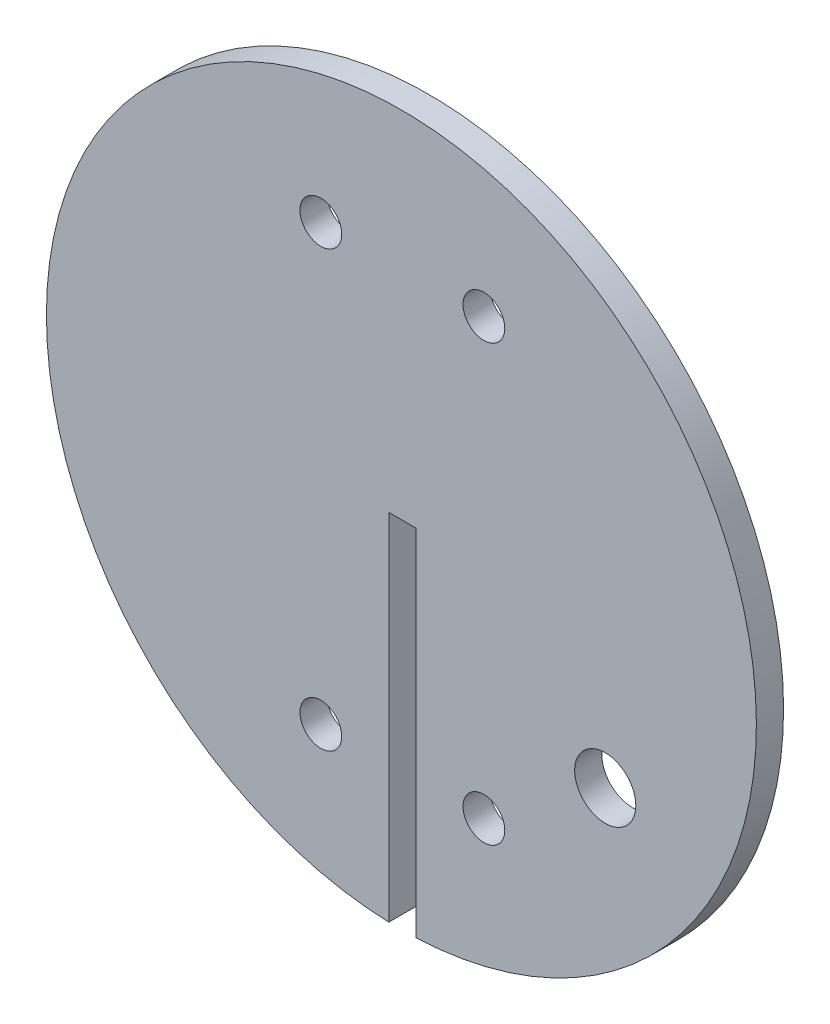
ISO-10303-21;
HEADER;
FILE_DESCRIPTION(('STEP AP214'),'2;1');
FILE_NAME('part.step','',(''),(''),'','','');
FILE_SCHEMA(('AUTOMOTIVE_DESIGN { 1 0 10303 214 1 1 1 1 }'));
ENDSEC;
DATA;
#1=APPLICATION_CONTEXT('core data for automotive mechanical design processes');
#2=APPLICATION_PROTOCOL_DEFINITION('international standard','automotive_design',2000,#1);
#3=PRODUCT_CONTEXT('',#1,'mechanical');
#4=PRODUCT('Part','Part','',(#3));
#5=PRODUCT_RELATED_PRODUCT_CATEGORY('part','',(#4));
#6=PRODUCT_DEFINITION_FORMATION('','',#4);
#7=PRODUCT_DEFINITION_CONTEXT('part definition',#1,'design');
#8=PRODUCT_DEFINITION('design','',#6,#7);
#9=PRODUCT_DEFINITION_SHAPE('','',#8);
#10=(LENGTH_UNIT() NAMED_UNIT(*) SI_UNIT(.MILLI.,.METRE.));
#11=(NAMED_UNIT(*) PLANE_ANGLE_UNIT() SI_UNIT($,.RADIAN.));
#12=(NAMED_UNIT(*) SI_UNIT($,.STERADIAN.) SOLID_ANGLE_UNIT());
#13=UNCERTAINTY_MEASURE_WITH_UNIT(LENGTH_MEASURE(1.E-05),#10,'distance_accuracy_value','');
#14=(GEOMETRIC_REPRESENTATION_CONTEXT(3) GLOBAL_UNCERTAINTY_ASSIGNED_CONTEXT((#13)) GLOBAL_UNIT_ASSIGNED_CONTEXT((#10,
#11,#12)) REPRESENTATION_CONTEXT('',''));
#15=CARTESIAN_POINT('',(0.,0.,0.));
#16=DIRECTION('',(0.,0.,1.));
#17=DIRECTION('',(1.,0.,0.));
#18=AXIS2_PLACEMENT_3D('',#15,#16,#17);
#19=CARTESIAN_POINT('',(0.,0.,5.08));
#20=DIRECTION('',(0.,0.,-1.));
#21=DIRECTION('',(-1.,0.,0.));
#22=AXIS2_PLACEMENT_3D('',#19,#20,#21);
#23=CYLINDRICAL_SURFACE('',#22,66.3575);
#24=DIRECTION('',(0.,0.,-1.));
#25=VECTOR('',#24,1.);
#26=CARTESIAN_POINT('',(2.71807751956726,-66.3018088806604,5.08));
#27=LINE('',#26,#25);
#28=CARTESIAN_POINT('',(2.71807751956726,-66.3018088806604,5.08));
#29=VERTEX_POINT('',#28);
#30=CARTESIAN_POINT('',(2.71807751956726,-66.3018088806604,0.));
#31=VERTEX_POINT('',#30);
#32=EDGE_CURVE('E71',#29,#31,#27,.T.);
#33=ORIENTED_EDGE('',*,*,#32,.T.);
#34=CARTESIAN_POINT('',(0.,0.,0.));
#35=DIRECTION('',(0.,0.,1.));
#36=DIRECTION('',(1.,0.,0.));
#37=AXIS2_PLACEMENT_3D('',#34,#35,#36);
#38=CIRCLE('',#37,66.3575);
#39=CARTESIAN_POINT('',(-2.36192248043274,-66.3154516568079,0.));
#40=VERTEX_POINT('',#39);
#41=EDGE_CURVE('E36',#31,#40,#38,.T.);
#42=ORIENTED_EDGE('',*,*,#41,.T.);
#43=DIRECTION('',(0.,0.,-1.));
#44=VECTOR('',#43,1.);
#45=CARTESIAN_POINT('',(-2.36192248043274,-66.3154516568079,5.08));
#46=LINE('',#45,#44);
#47=CARTESIAN_POINT('',(-2.36192248043274,-66.3154516568079,5.08));
#48=VERTEX_POINT('',#47);
#49=EDGE_CURVE('E80',#48,#40,#46,.T.);
#50=ORIENTED_EDGE('',*,*,#49,.F.);
#51=CARTESIAN_POINT('',(0.,0.,5.08));
#52=DIRECTION('',(0.,0.,1.));
#53=DIRECTION('',(1.,0.,0.));
#54=AXIS2_PLACEMENT_3D('',#51,#52,#53);
#55=CIRCLE('',#54,66.3575);
#56=EDGE_CURVE('E11',#29,#48,#55,.T.);
#57=ORIENTED_EDGE('',*,*,#56,.F.);
#58=EDGE_LOOP('',(#33,#42,#50,#57));
#59=FACE_BOUND('',#58,.T.);
#60=ADVANCED_FACE('F33',(#59),#23,.T.);
#61=CARTESIAN_POINT('',(0.,0.,5.08));
#62=DIRECTION('',(0.,0.,1.));
#63=DIRECTION('',(1.,0.,0.));
#64=AXIS2_PLACEMENT_3D('',#61,#62,#63);
#65=PLANE('',#64);
#66=CARTESIAN_POINT('',(38.1,-24.3685333145667,5.08));
#67=DIRECTION('',(0.,0.,1.));
#68=DIRECTION('',(1.,0.,0.));
#69=AXIS2_PLACEMENT_3D('',#66,#67,#68);
#70=CIRCLE('',#69,5.715);
#71=CARTESIAN_POINT('',(43.815,-24.3685333145667,5.08));
#72=VERTEX_POINT('',#71);
#73=EDGE_CURVE('E162',#72,#72,#70,.T.);
#74=ORIENTED_EDGE('',*,*,#73,.F.);
#75=EDGE_LOOP('',(#74));
#76=FACE_BOUND('',#75,.T.);
#77=CARTESIAN_POINT('',(-15.0619224804327,40.64,5.08));
#78=DIRECTION('',(0.,0.,1.));
#79=DIRECTION('',(1.,0.,0.));
#80=AXIS2_PLACEMENT_3D('',#77,#78,#79);
#81=CIRCLE('',#80,3.90061697542542);
#82=CARTESIAN_POINT('',(-11.1613055050073,40.64,5.08));
#83=VERTEX_POINT('',#82);
#84=EDGE_CURVE('E92',#83,#83,#81,.F.);
#85=ORIENTED_EDGE('',*,*,#84,.T.);
#86=EDGE_LOOP('',(#85));
#87=FACE_BOUND('',#86,.T.);
#88=CARTESIAN_POINT('',(15.4180775195673,40.64,5.08));
#89=DIRECTION('',(0.,0.,1.));
#90=DIRECTION('',(1.,0.,0.));
#91=AXIS2_PLACEMENT_3D('',#88,#89,#90);
#92=CIRCLE('',#91,3.90061697542542);
#93=CARTESIAN_POINT('',(19.3186944949927,40.64,5.08));
#94=VERTEX_POINT('',#93);
#95=EDGE_CURVE('E99',#94,#94,#92,.F.);
#96=ORIENTED_EDGE('',*,*,#95,.T.);
#97=EDGE_LOOP('',(#96));
#98=FACE_BOUND('',#97,.T.);
#99=CARTESIAN_POINT('',(-15.0619224804327,-40.64,5.08));
#100=DIRECTION('',(0.,0.,1.));
#101=DIRECTION('',(1.,0.,0.));
#102=AXIS2_PLACEMENT_3D('',#99,#100,#101);
#103=CIRCLE('',#102,3.90061697542542);
#104=CARTESIAN_POINT('',(-11.1613055050073,-40.64,5.08));
#105=VERTEX_POINT('',#104);
#106=EDGE_CURVE('E102',#105,#105,#103,.T.);
#107=ORIENTED_EDGE('',*,*,#106,.F.);
#108=EDGE_LOOP('',(#107));
#109=FACE_BOUND('',#108,.T.);
#110=CARTESIAN_POINT('',(15.4180775195673,-40.64,5.08));
#111=DIRECTION('',(0.,0.,1.));
#112=DIRECTION('',(1.,0.,0.));
#113=AXIS2_PLACEMENT_3D('',#110,#111,#112);
#114=CIRCLE('',#113,3.90061697542542);
#115=CARTESIAN_POINT('',(19.3186944949927,-40.64,5.08));
#116=VERTEX_POINT('',#115);
#117=EDGE_CURVE('E113',#116,#116,#114,.T.);
#118=ORIENTED_EDGE('',*,*,#117,.F.);
#119=EDGE_LOOP('',(#118));
#120=FACE_BOUND('',#119,.T.);
#121=DIRECTION('',(-1.,0.,0.));
#122=VECTOR('',#121,1.);
#123=CARTESIAN_POINT('',(2.71807751956726,0.0228517898858147,5.08));
#124=LINE('',#123,#122);
#125=CARTESIAN_POINT('',(2.71807751956726,0.0228517898858147,5.08));
#126=VERTEX_POINT('',#125);
#127=CARTESIAN_POINT('',(-2.36192248043274,0.0228517898858138,5.08));
#128=VERTEX_POINT('',#127);
#129=EDGE_CURVE('E81',#126,#128,#124,.T.);
#130=ORIENTED_EDGE('',*,*,#129,.F.);
#131=DIRECTION('',(0.,1.,0.));
#132=VECTOR('',#131,1.);
#133=CARTESIAN_POINT('',(2.71807751956726,-67.8586482101142,5.08));
#134=LINE('',#133,#132);
#135=EDGE_CURVE('E74',#29,#126,#134,.T.);
#136=ORIENTED_EDGE('',*,*,#135,.F.);
#137=ORIENTED_EDGE('',*,*,#56,.T.);
#138=DIRECTION('',(0.,1.,0.));
#139=VECTOR('',#138,1.);
#140=CARTESIAN_POINT('',(-2.36192248043274,-67.8586482101142,5.08));
#141=LINE('',#140,#139);
#142=EDGE_CURVE('E166',#48,#128,#141,.T.);
#143=ORIENTED_EDGE('',*,*,#142,.T.);
#144=EDGE_LOOP('',(#130,#136,#137,#143));
#145=FACE_BOUND('',#144,.T.);
#146=ADVANCED_FACE('F84',(#76,#87,#98,#109,#120,#145),#65,.T.);
#147=CARTESIAN_POINT('',(0.,0.,0.));
#148=DIRECTION('',(0.,0.,1.));
#149=DIRECTION('',(1.,0.,0.));
#150=AXIS2_PLACEMENT_3D('',#147,#148,#149);
#151=PLANE('',#150);
#152=CARTESIAN_POINT('',(38.1,-24.3685333145667,0.));
#153=DIRECTION('',(0.,0.,1.));
#154=DIRECTION('',(1.,0.,0.));
#155=AXIS2_PLACEMENT_3D('',#152,#153,#154);
#156=CIRCLE('',#155,5.715);
#157=CARTESIAN_POINT('',(43.815,-24.3685333145667,0.));
#158=VERTEX_POINT('',#157);
#159=EDGE_CURVE('E165',#158,#158,#156,.T.);
#160=ORIENTED_EDGE('',*,*,#159,.T.);
#161=EDGE_LOOP('',(#160));
#162=FACE_BOUND('',#161,.T.);
#163=CARTESIAN_POINT('',(15.4180775195673,-40.64,0.));
#164=DIRECTION('',(0.,0.,1.));
#165=DIRECTION('',(1.,0.,0.));
#166=AXIS2_PLACEMENT_3D('',#163,#164,#165);
#167=CIRCLE('',#166,3.90061697542542);
#168=CARTESIAN_POINT('',(19.3186944949927,-40.64,0.));
#169=VERTEX_POINT('',#168);
#170=EDGE_CURVE('E110',#169,#169,#167,.T.);
#171=ORIENTED_EDGE('',*,*,#170,.T.);
#172=EDGE_LOOP('',(#171));
#173=FACE_BOUND('',#172,.T.);
#174=CARTESIAN_POINT('',(-15.0619224804327,-40.64,0.));
#175=DIRECTION('',(0.,0.,1.));
#176=DIRECTION('',(1.,0.,0.));
#177=AXIS2_PLACEMENT_3D('',#174,#175,#176);
#178=CIRCLE('',#177,3.90061697542542);
#179=CARTESIAN_POINT('',(-11.1613055050073,-40.64,0.));
#180=VERTEX_POINT('',#179);
#181=EDGE_CURVE('E107',#180,#180,#178,.T.);
#182=ORIENTED_EDGE('',*,*,#181,.T.);
#183=EDGE_LOOP('',(#182));
#184=FACE_BOUND('',#183,.T.);
#185=CARTESIAN_POINT('',(15.4180775195673,40.64,0.));
#186=DIRECTION('',(0.,0.,-1.));
#187=DIRECTION('',(-1.,0.,0.));
#188=AXIS2_PLACEMENT_3D('',#185,#186,#187);
#189=CIRCLE('',#188,3.90061697542542);
#190=CARTESIAN_POINT('',(11.5174605441418,40.64,0.));
#191=VERTEX_POINT('',#190);
#192=EDGE_CURVE('E97',#191,#191,#189,.T.);
#193=ORIENTED_EDGE('',*,*,#192,.F.);
#194=EDGE_LOOP('',(#193));
#195=FACE_BOUND('',#194,.T.);
#196=CARTESIAN_POINT('',(-15.0619224804327,40.64,0.));
#197=DIRECTION('',(0.,0.,-1.));
#198=DIRECTION('',(-1.,0.,0.));
#199=AXIS2_PLACEMENT_3D('',#196,#197,#198);
#200=CIRCLE('',#199,3.90061697542542);
#201=CARTESIAN_POINT('',(-18.9625394558582,40.64,0.));
#202=VERTEX_POINT('',#201);
#203=EDGE_CURVE('E89',#202,#202,#200,.T.);
#204=ORIENTED_EDGE('',*,*,#203,.F.);
#205=EDGE_LOOP('',(#204));
#206=FACE_BOUND('',#205,.T.);
#207=DIRECTION('',(0.,1.,0.));
#208=VECTOR('',#207,1.);
#209=CARTESIAN_POINT('',(2.71807751956726,-67.8586482101142,0.));
#210=LINE('',#209,#208);
#211=CARTESIAN_POINT('',(2.71807751956726,0.0228517898858147,0.));
#212=VERTEX_POINT('',#211);
#213=EDGE_CURVE('E55',#31,#212,#210,.T.);
#214=ORIENTED_EDGE('',*,*,#213,.T.);
#215=DIRECTION('',(-1.,0.,0.));
#216=VECTOR('',#215,1.);
#217=CARTESIAN_POINT('',(2.71807751956726,0.0228517898858147,0.));
#218=LINE('',#217,#216);
#219=CARTESIAN_POINT('',(-2.36192248043274,0.0228517898858138,0.));
#220=VERTEX_POINT('',#219);
#221=EDGE_CURVE('E176',#212,#220,#218,.T.);
#222=ORIENTED_EDGE('',*,*,#221,.T.);
#223=DIRECTION('',(0.,1.,0.));
#224=VECTOR('',#223,1.);
#225=CARTESIAN_POINT('',(-2.36192248043274,-67.8586482101142,0.));
#226=LINE('',#225,#224);
#227=EDGE_CURVE('E47',#40,#220,#226,.T.);
#228=ORIENTED_EDGE('',*,*,#227,.F.);
#229=ORIENTED_EDGE('',*,*,#41,.F.);
#230=EDGE_LOOP('',(#214,#222,#228,#229));
#231=FACE_BOUND('',#230,.T.);
#232=ADVANCED_FACE('F121',(#162,#173,#184,#195,#206,#231),#151,.F.);
#233=CARTESIAN_POINT('',(15.4180775195673,-40.64,5.081));
#234=DIRECTION('',(0.,0.,-1.));
#235=DIRECTION('',(-1.,0.,0.));
#236=AXIS2_PLACEMENT_3D('',#233,#234,#235);
#237=CYLINDRICAL_SURFACE('',#236,3.90061697542542);
#238=ORIENTED_EDGE('',*,*,#117,.T.);
#239=EDGE_LOOP('',(#238));
#240=FACE_BOUND('',#239,.T.);
#241=ORIENTED_EDGE('',*,*,#170,.F.);
#242=EDGE_LOOP('',(#241));
#243=FACE_BOUND('',#242,.T.);
#244=ADVANCED_FACE('F117',(#240,#243),#237,.F.);
#245=CARTESIAN_POINT('',(-15.0619224804327,-40.64,5.081));
#246=DIRECTION('',(0.,0.,-1.));
#247=DIRECTION('',(-1.,0.,0.));
#248=AXIS2_PLACEMENT_3D('',#245,#246,#247);
#249=CYLINDRICAL_SURFACE('',#248,3.90061697542542);
#250=ORIENTED_EDGE('',*,*,#106,.T.);
#251=EDGE_LOOP('',(#250));
#252=FACE_BOUND('',#251,.T.);
#253=ORIENTED_EDGE('',*,*,#181,.F.);
#254=EDGE_LOOP('',(#253));
#255=FACE_BOUND('',#254,.T.);
#256=ADVANCED_FACE('F134',(#252,#255),#249,.F.);
#257=CARTESIAN_POINT('',(15.4180775195673,40.64,5.081));
#258=DIRECTION('',(0.,0.,-1.));
#259=DIRECTION('',(-1.,0.,0.));
#260=AXIS2_PLACEMENT_3D('',#257,#258,#259);
#261=CYLINDRICAL_SURFACE('',#260,3.90061697542542);
#262=ORIENTED_EDGE('',*,*,#95,.F.);
#263=EDGE_LOOP('',(#262));
#264=FACE_BOUND('',#263,.T.);
#265=ORIENTED_EDGE('',*,*,#192,.T.);
#266=EDGE_LOOP('',(#265));
#267=FACE_BOUND('',#266,.T.);
#268=ADVANCED_FACE('F137',(#264,#267),#261,.F.);
#269=CARTESIAN_POINT('',(-15.0619224804327,40.64,5.081));
#270=DIRECTION('',(0.,0.,-1.));
#271=DIRECTION('',(-1.,0.,0.));
#272=AXIS2_PLACEMENT_3D('',#269,#270,#271);
#273=CYLINDRICAL_SURFACE('',#272,3.90061697542542);
#274=ORIENTED_EDGE('',*,*,#84,.F.);
#275=EDGE_LOOP('',(#274));
#276=FACE_BOUND('',#275,.T.);
#277=ORIENTED_EDGE('',*,*,#203,.T.);
#278=EDGE_LOOP('',(#277));
#279=FACE_BOUND('',#278,.T.);
#280=ADVANCED_FACE('F141',(#276,#279),#273,.F.);
#281=CARTESIAN_POINT('',(2.71807751956726,-67.8586482101142,5.081));
#282=DIRECTION('',(-1.,0.,0.));
#283=DIRECTION('',(0.,0.,1.));
#284=AXIS2_PLACEMENT_3D('',#281,#282,#283);
#285=PLANE('',#284);
#286=ORIENTED_EDGE('',*,*,#135,.T.);
#287=DIRECTION('',(0.,0.,-1.));
#288=VECTOR('',#287,1.);
#289=CARTESIAN_POINT('',(2.71807751956726,0.0228517898858147,5.081));
#290=LINE('',#289,#288);
#291=EDGE_CURVE('E168',#126,#212,#290,.T.);
#292=ORIENTED_EDGE('',*,*,#291,.T.);
#293=ORIENTED_EDGE('',*,*,#213,.F.);
#294=ORIENTED_EDGE('',*,*,#32,.F.);
#295=EDGE_LOOP('',(#286,#292,#293,#294));
#296=FACE_BOUND('',#295,.T.);
#297=ADVANCED_FACE('F73',(#296),#285,.T.);
#298=CARTESIAN_POINT('',(-2.36192248043274,-67.8586482101142,5.081));
#299=DIRECTION('',(-1.,0.,0.));
#300=DIRECTION('',(0.,0.,1.));
#301=AXIS2_PLACEMENT_3D('',#298,#299,#300);
#302=PLANE('',#301);
#303=ORIENTED_EDGE('',*,*,#49,.T.);
#304=ORIENTED_EDGE('',*,*,#227,.T.);
#305=DIRECTION('',(0.,0.,-1.));
#306=VECTOR('',#305,1.);
#307=CARTESIAN_POINT('',(-2.36192248043274,0.0228517898858138,5.081));
#308=LINE('',#307,#306);
#309=EDGE_CURVE('E172',#128,#220,#308,.T.);
#310=ORIENTED_EDGE('',*,*,#309,.F.);
#311=ORIENTED_EDGE('',*,*,#142,.F.);
#312=EDGE_LOOP('',(#303,#304,#310,#311));
#313=FACE_BOUND('',#312,.T.);
#314=ADVANCED_FACE('F148',(#313),#302,.F.);
#315=CARTESIAN_POINT('',(2.71807751956726,0.0228517898858147,5.081));
#316=DIRECTION('',(0.,-1.,0.));
#317=DIRECTION('',(1.,0.,0.));
#318=AXIS2_PLACEMENT_3D('',#315,#316,#317);
#319=PLANE('',#318);
#320=ORIENTED_EDGE('',*,*,#129,.T.);
#321=ORIENTED_EDGE('',*,*,#309,.T.);
#322=ORIENTED_EDGE('',*,*,#221,.F.);
#323=ORIENTED_EDGE('',*,*,#291,.F.);
#324=EDGE_LOOP('',(#320,#321,#322,#323));
#325=FACE_BOUND('',#324,.T.);
#326=ADVANCED_FACE('F149',(#325),#319,.T.);
#327=CARTESIAN_POINT('',(38.1,-24.3685333145667,5.081));
#328=DIRECTION('',(0.,0.,-1.));
#329=DIRECTION('',(-1.,0.,0.));
#330=AXIS2_PLACEMENT_3D('',#327,#328,#329);
#331=CYLINDRICAL_SURFACE('',#330,5.715);
#332=ORIENTED_EDGE('',*,*,#73,.T.);
#333=EDGE_LOOP('',(#332));
#334=FACE_BOUND('',#333,.T.);
#335=ORIENTED_EDGE('',*,*,#159,.F.);
#336=EDGE_LOOP('',(#335));
#337=FACE_BOUND('',#336,.T.);
#338=ADVANCED_FACE('F152',(#334,#337),#331,.F.);
#339=CLOSED_SHELL('',(#60,#146,#232,#244,#256,#268,#280,#297,#314,#326,#338));
#340=MANIFOLD_SOLID_BREP('B2',#339);
#341=ADVANCED_BREP_SHAPE_REPRESENTATION('',(#18,#340),#14);
#342=SHAPE_DEFINITION_REPRESENTATION(#9,#341);
ENDSEC;
END-ISO-10303-21;
